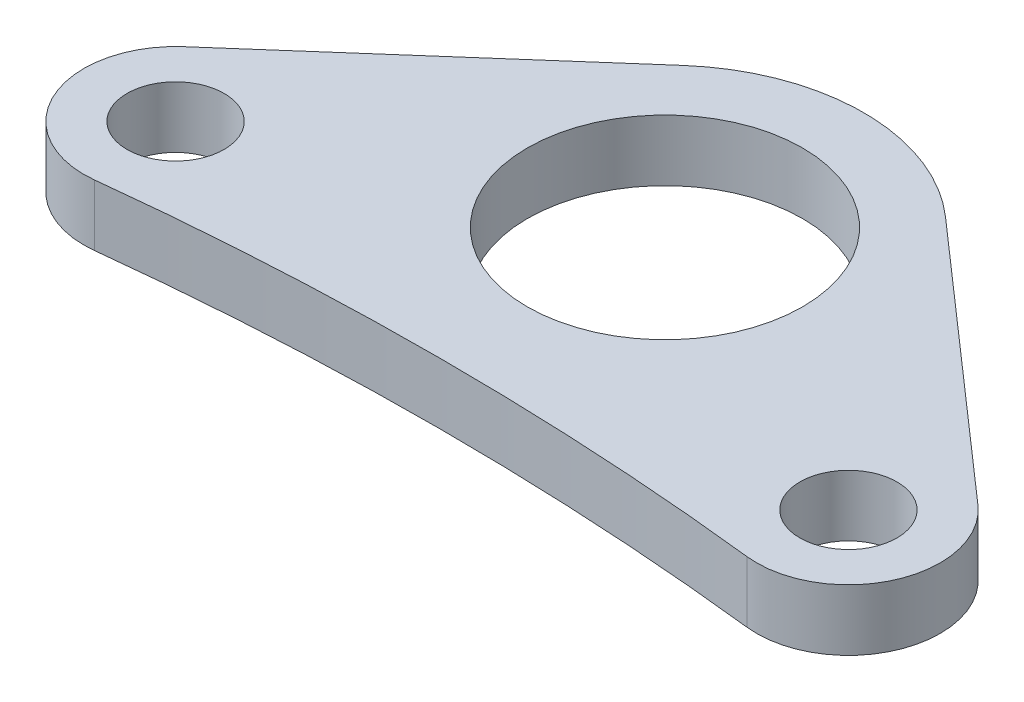
ISO-10303-21;
HEADER;
FILE_DESCRIPTION(('STEP AP214'),'2;1');
FILE_NAME('part.step','',(''),(''),'','','');
FILE_SCHEMA(('AUTOMOTIVE_DESIGN { 1 0 10303 214 1 1 1 1 }'));
ENDSEC;
DATA;
#1=APPLICATION_CONTEXT('core data for automotive mechanical design processes');
#2=APPLICATION_PROTOCOL_DEFINITION('international standard','automotive_design',2000,#1);
#3=PRODUCT_CONTEXT('',#1,'mechanical');
#4=PRODUCT('Part','Part','',(#3));
#5=PRODUCT_RELATED_PRODUCT_CATEGORY('part','',(#4));
#6=PRODUCT_DEFINITION_FORMATION('','',#4);
#7=PRODUCT_DEFINITION_CONTEXT('part definition',#1,'design');
#8=PRODUCT_DEFINITION('design','',#6,#7);
#9=PRODUCT_DEFINITION_SHAPE('','',#8);
#10=(LENGTH_UNIT() NAMED_UNIT(*) SI_UNIT(.MILLI.,.METRE.));
#11=(NAMED_UNIT(*) PLANE_ANGLE_UNIT() SI_UNIT($,.RADIAN.));
#12=(NAMED_UNIT(*) SI_UNIT($,.STERADIAN.) SOLID_ANGLE_UNIT());
#13=UNCERTAINTY_MEASURE_WITH_UNIT(LENGTH_MEASURE(1.E-05),#10,'distance_accuracy_value','');
#14=(GEOMETRIC_REPRESENTATION_CONTEXT(3) GLOBAL_UNCERTAINTY_ASSIGNED_CONTEXT((#13)) GLOBAL_UNIT_ASSIGNED_CONTEXT((#10,
#11,#12)) REPRESENTATION_CONTEXT('',''));
#15=CARTESIAN_POINT('',(0.,0.,0.));
#16=DIRECTION('',(0.,0.,1.));
#17=DIRECTION('',(1.,0.,0.));
#18=AXIS2_PLACEMENT_3D('',#15,#16,#17);
#19=CARTESIAN_POINT('',(0.,6.35,325.697740611466));
#20=DIRECTION('',(0.,-1.,0.));
#21=DIRECTION('',(0.,0.,-1.));
#22=AXIS2_PLACEMENT_3D('',#19,#20,#21);
#23=PLANE('',#22);
#24=CARTESIAN_POINT('',(-34.925,6.35,15.875));
#25=DIRECTION('',(0.,1.,0.));
#26=DIRECTION('',(0.,0.,1.));
#27=AXIS2_PLACEMENT_3D('',#24,#25,#26);
#28=CIRCLE('',#27,5.04189999999999);
#29=CARTESIAN_POINT('',(-34.925,6.35,20.9169));
#30=VERTEX_POINT('',#29);
#31=EDGE_CURVE('E187',#30,#30,#28,.T.);
#32=ORIENTED_EDGE('',*,*,#31,.F.);
#33=EDGE_LOOP('',(#32));
#34=FACE_BOUND('',#33,.T.);
#35=CARTESIAN_POINT('',(34.925,6.35,15.875));
#36=DIRECTION('',(0.,1.,0.));
#37=DIRECTION('',(0.,0.,1.));
#38=AXIS2_PLACEMENT_3D('',#35,#36,#37);
#39=CIRCLE('',#38,5.04189999999999);
#40=CARTESIAN_POINT('',(34.925,6.35,20.9169));
#41=VERTEX_POINT('',#40);
#42=EDGE_CURVE('E189',#41,#41,#39,.T.);
#43=ORIENTED_EDGE('',*,*,#42,.F.);
#44=EDGE_LOOP('',(#43));
#45=FACE_BOUND('',#44,.T.);
#46=CARTESIAN_POINT('',(0.,6.35,325.697740611466));
#47=DIRECTION('',(0.,-1.,0.));
#48=DIRECTION('',(0.,0.,-1.));
#49=AXIS2_PLACEMENT_3D('',#46,#47,#48);
#50=CIRCLE('',#49,302.26);
#51=CARTESIAN_POINT('',(-33.8580448065173,6.35,25.3400531755031));
#52=VERTEX_POINT('',#51);
#53=CARTESIAN_POINT('',(33.8580448065173,6.35,25.3400531755031));
#54=VERTEX_POINT('',#53);
#55=EDGE_CURVE('E137',#52,#54,#50,.T.);
#56=ORIENTED_EDGE('',*,*,#55,.T.);
#57=CARTESIAN_POINT('',(34.925,6.35,15.875));
#58=DIRECTION('',(0.,1.,0.));
#59=DIRECTION('',(0.,0.,1.));
#60=AXIS2_PLACEMENT_3D('',#57,#58,#59);
#61=CIRCLE('',#60,9.52500000000003);
#62=CARTESIAN_POINT('',(41.2092275392722,6.35,8.7171994136011));
#63=VERTEX_POINT('',#62);
#64=EDGE_CURVE('E95',#54,#63,#61,.T.);
#65=ORIENTED_EDGE('',*,*,#64,.T.);
#66=DIRECTION('',(-0.751475127180987,0.,-0.659761421445903));
#67=VECTOR('',#66,1.);
#68=CARTESIAN_POINT('',(13.6158263350898,6.35,-15.5085679371976));
#69=LINE('',#68,#67);
#70=CARTESIAN_POINT('',(13.6158263350898,6.35,-15.5085679371976));
#71=VERTEX_POINT('',#70);
#72=EDGE_CURVE('E108',#63,#71,#69,.T.);
#73=ORIENTED_EDGE('',*,*,#72,.T.);
#74=CARTESIAN_POINT('',(0.,6.35,0.));
#75=DIRECTION('',(0.,1.,0.));
#76=DIRECTION('',(0.,0.,-1.));
#77=AXIS2_PLACEMENT_3D('',#74,#75,#76);
#78=CIRCLE('',#77,20.6375);
#79=CARTESIAN_POINT('',(-13.6158263350898,6.35,-15.5085679371976));
#80=VERTEX_POINT('',#79);
#81=EDGE_CURVE('E102',#71,#80,#78,.T.);
#82=ORIENTED_EDGE('',*,*,#81,.T.);
#83=DIRECTION('',(-0.751475127180987,0.,0.659761421445904));
#84=VECTOR('',#83,1.);
#85=CARTESIAN_POINT('',(-41.2092275392722,6.35,8.7171994136011));
#86=LINE('',#85,#84);
#87=CARTESIAN_POINT('',(-41.2092275392723,6.35,8.71719941360108));
#88=VERTEX_POINT('',#87);
#89=EDGE_CURVE('E106',#80,#88,#86,.T.);
#90=ORIENTED_EDGE('',*,*,#89,.T.);
#91=CARTESIAN_POINT('',(-34.925,6.35,15.875));
#92=DIRECTION('',(0.,1.,0.));
#93=DIRECTION('',(0.,0.,-1.));
#94=AXIS2_PLACEMENT_3D('',#91,#92,#93);
#95=CIRCLE('',#94,9.52500000000003);
#96=EDGE_CURVE('E58',#88,#52,#95,.T.);
#97=ORIENTED_EDGE('',*,*,#96,.T.);
#98=EDGE_LOOP('',(#56,#65,#73,#82,#90,#97));
#99=FACE_BOUND('',#98,.T.);
#100=CARTESIAN_POINT('',(0.,6.35,0.));
#101=DIRECTION('',(0.,1.,0.));
#102=DIRECTION('',(0.,0.,1.));
#103=AXIS2_PLACEMENT_3D('',#100,#101,#102);
#104=CIRCLE('',#103,14.2875);
#105=CARTESIAN_POINT('',(0.,6.35,14.2875));
#106=VERTEX_POINT('',#105);
#107=EDGE_CURVE('E130',#106,#106,#104,.T.);
#108=ORIENTED_EDGE('',*,*,#107,.F.);
#109=EDGE_LOOP('',(#108));
#110=FACE_BOUND('',#109,.T.);
#111=ADVANCED_FACE('F41',(#34,#45,#99,#110),#23,.F.);
#112=CARTESIAN_POINT('',(0.,0.,325.697740611466));
#113=DIRECTION('',(0.,-1.,0.));
#114=DIRECTION('',(0.,0.,-1.));
#115=AXIS2_PLACEMENT_3D('',#112,#113,#114);
#116=PLANE('',#115);
#117=CARTESIAN_POINT('',(-34.925,0.,15.875));
#118=DIRECTION('',(0.,1.,0.));
#119=DIRECTION('',(0.,0.,1.));
#120=AXIS2_PLACEMENT_3D('',#117,#118,#119);
#121=CIRCLE('',#120,5.0419);
#122=CARTESIAN_POINT('',(-34.925,0.,20.9169));
#123=VERTEX_POINT('',#122);
#124=EDGE_CURVE('E185',#123,#123,#121,.T.);
#125=ORIENTED_EDGE('',*,*,#124,.T.);
#126=EDGE_LOOP('',(#125));
#127=FACE_BOUND('',#126,.T.);
#128=CARTESIAN_POINT('',(34.925,0.,15.875));
#129=DIRECTION('',(0.,1.,0.));
#130=DIRECTION('',(0.,0.,1.));
#131=AXIS2_PLACEMENT_3D('',#128,#129,#130);
#132=CIRCLE('',#131,5.0419);
#133=CARTESIAN_POINT('',(34.925,0.,20.9169));
#134=VERTEX_POINT('',#133);
#135=EDGE_CURVE('E194',#134,#134,#132,.T.);
#136=ORIENTED_EDGE('',*,*,#135,.T.);
#137=EDGE_LOOP('',(#136));
#138=FACE_BOUND('',#137,.T.);
#139=CARTESIAN_POINT('',(0.,0.,325.697740611466));
#140=DIRECTION('',(0.,-1.,0.));
#141=DIRECTION('',(0.,0.,-1.));
#142=AXIS2_PLACEMENT_3D('',#139,#140,#141);
#143=CIRCLE('',#142,302.26);
#144=CARTESIAN_POINT('',(-33.8580448065173,0.,25.3400531755031));
#145=VERTEX_POINT('',#144);
#146=CARTESIAN_POINT('',(33.8580448065173,0.,25.3400531755031));
#147=VERTEX_POINT('',#146);
#148=EDGE_CURVE('E126',#145,#147,#143,.T.);
#149=ORIENTED_EDGE('',*,*,#148,.F.);
#150=CARTESIAN_POINT('',(-34.925,0.,15.875));
#151=DIRECTION('',(0.,1.,0.));
#152=DIRECTION('',(0.,0.,-1.));
#153=AXIS2_PLACEMENT_3D('',#150,#151,#152);
#154=CIRCLE('',#153,9.52500000000003);
#155=CARTESIAN_POINT('',(-41.2092275392723,0.,8.71719941360108));
#156=VERTEX_POINT('',#155);
#157=EDGE_CURVE('E87',#156,#145,#154,.T.);
#158=ORIENTED_EDGE('',*,*,#157,.F.);
#159=DIRECTION('',(-0.751475127180987,0.,0.659761421445904));
#160=VECTOR('',#159,1.);
#161=CARTESIAN_POINT('',(-41.2092275392722,0.,8.7171994136011));
#162=LINE('',#161,#160);
#163=CARTESIAN_POINT('',(-13.6158263350898,0.,-15.5085679371976));
#164=VERTEX_POINT('',#163);
#165=EDGE_CURVE('E81',#164,#156,#162,.T.);
#166=ORIENTED_EDGE('',*,*,#165,.F.);
#167=CARTESIAN_POINT('',(0.,0.,0.));
#168=DIRECTION('',(0.,1.,0.));
#169=DIRECTION('',(0.,0.,-1.));
#170=AXIS2_PLACEMENT_3D('',#167,#168,#169);
#171=CIRCLE('',#170,20.6375);
#172=CARTESIAN_POINT('',(13.6158263350898,0.,-15.5085679371976));
#173=VERTEX_POINT('',#172);
#174=EDGE_CURVE('E116',#173,#164,#171,.T.);
#175=ORIENTED_EDGE('',*,*,#174,.F.);
#176=DIRECTION('',(-0.751475127180987,0.,-0.659761421445903));
#177=VECTOR('',#176,1.);
#178=CARTESIAN_POINT('',(13.6158263350898,0.,-15.5085679371976));
#179=LINE('',#178,#177);
#180=CARTESIAN_POINT('',(41.2092275392722,0.,8.7171994136011));
#181=VERTEX_POINT('',#180);
#182=EDGE_CURVE('E132',#181,#173,#179,.T.);
#183=ORIENTED_EDGE('',*,*,#182,.F.);
#184=CARTESIAN_POINT('',(34.925,0.,15.875));
#185=DIRECTION('',(0.,1.,0.));
#186=DIRECTION('',(0.,0.,1.));
#187=AXIS2_PLACEMENT_3D('',#184,#185,#186);
#188=CIRCLE('',#187,9.52500000000003);
#189=EDGE_CURVE('E129',#147,#181,#188,.T.);
#190=ORIENTED_EDGE('',*,*,#189,.F.);
#191=EDGE_LOOP('',(#149,#158,#166,#175,#183,#190));
#192=FACE_BOUND('',#191,.T.);
#193=CARTESIAN_POINT('',(0.,0.,0.));
#194=DIRECTION('',(0.,1.,0.));
#195=DIRECTION('',(0.,0.,1.));
#196=AXIS2_PLACEMENT_3D('',#193,#194,#195);
#197=CIRCLE('',#196,14.2875);
#198=CARTESIAN_POINT('',(0.,0.,14.2875));
#199=VERTEX_POINT('',#198);
#200=EDGE_CURVE('E197',#199,#199,#197,.T.);
#201=ORIENTED_EDGE('',*,*,#200,.T.);
#202=EDGE_LOOP('',(#201));
#203=FACE_BOUND('',#202,.T.);
#204=ADVANCED_FACE('F146',(#127,#138,#192,#203),#116,.T.);
#205=CARTESIAN_POINT('',(0.,6.35,325.697740611466));
#206=DIRECTION('',(0.,-1.,0.));
#207=DIRECTION('',(0.,0.,-1.));
#208=AXIS2_PLACEMENT_3D('',#205,#206,#207);
#209=CYLINDRICAL_SURFACE('',#208,302.26);
#210=ORIENTED_EDGE('',*,*,#148,.T.);
#211=DIRECTION('',(0.,-1.,0.));
#212=VECTOR('',#211,1.);
#213=CARTESIAN_POINT('',(33.8580448065173,6.35,25.3400531755031));
#214=LINE('',#213,#212);
#215=EDGE_CURVE('E11',#54,#147,#214,.T.);
#216=ORIENTED_EDGE('',*,*,#215,.F.);
#217=ORIENTED_EDGE('',*,*,#55,.F.);
#218=DIRECTION('',(0.,-1.,0.));
#219=VECTOR('',#218,1.);
#220=CARTESIAN_POINT('',(-33.8580448065173,6.35,25.3400531755031));
#221=LINE('',#220,#219);
#222=EDGE_CURVE('E122',#52,#145,#221,.T.);
#223=ORIENTED_EDGE('',*,*,#222,.T.);
#224=EDGE_LOOP('',(#210,#216,#217,#223));
#225=FACE_BOUND('',#224,.T.);
#226=ADVANCED_FACE('F43',(#225),#209,.F.);
#227=CARTESIAN_POINT('',(34.925,6.35,15.875));
#228=DIRECTION('',(0.,-1.,0.));
#229=DIRECTION('',(0.,0.,-1.));
#230=AXIS2_PLACEMENT_3D('',#227,#228,#229);
#231=CYLINDRICAL_SURFACE('',#230,9.52500000000003);
#232=ORIENTED_EDGE('',*,*,#189,.T.);
#233=DIRECTION('',(0.,-1.,0.));
#234=VECTOR('',#233,1.);
#235=CARTESIAN_POINT('',(41.2092275392722,6.35,8.7171994136011));
#236=LINE('',#235,#234);
#237=EDGE_CURVE('E50',#63,#181,#236,.T.);
#238=ORIENTED_EDGE('',*,*,#237,.F.);
#239=ORIENTED_EDGE('',*,*,#64,.F.);
#240=ORIENTED_EDGE('',*,*,#215,.T.);
#241=EDGE_LOOP('',(#232,#238,#239,#240));
#242=FACE_BOUND('',#241,.T.);
#243=ADVANCED_FACE('F234',(#242),#231,.T.);
#244=CARTESIAN_POINT('',(13.6158263350898,6.35,-15.5085679371976));
#245=DIRECTION('',(-0.659761421445903,0.,0.751475127180987));
#246=DIRECTION('',(0.751475127180987,0.,0.659761421445903));
#247=AXIS2_PLACEMENT_3D('',#244,#245,#246);
#248=PLANE('',#247);
#249=ORIENTED_EDGE('',*,*,#182,.T.);
#250=DIRECTION('',(0.,-1.,0.));
#251=VECTOR('',#250,1.);
#252=CARTESIAN_POINT('',(13.6158263350898,6.35,-15.5085679371976));
#253=LINE('',#252,#251);
#254=EDGE_CURVE('E117',#71,#173,#253,.T.);
#255=ORIENTED_EDGE('',*,*,#254,.F.);
#256=ORIENTED_EDGE('',*,*,#72,.F.);
#257=ORIENTED_EDGE('',*,*,#237,.T.);
#258=EDGE_LOOP('',(#249,#255,#256,#257));
#259=FACE_BOUND('',#258,.T.);
#260=ADVANCED_FACE('F143',(#259),#248,.F.);
#261=CARTESIAN_POINT('',(0.,6.35,0.));
#262=DIRECTION('',(0.,-1.,0.));
#263=DIRECTION('',(0.,0.,-1.));
#264=AXIS2_PLACEMENT_3D('',#261,#262,#263);
#265=CYLINDRICAL_SURFACE('',#264,20.6375);
#266=ORIENTED_EDGE('',*,*,#174,.T.);
#267=DIRECTION('',(0.,-1.,0.));
#268=VECTOR('',#267,1.);
#269=CARTESIAN_POINT('',(-13.6158263350898,6.35,-15.5085679371976));
#270=LINE('',#269,#268);
#271=EDGE_CURVE('E113',#80,#164,#270,.T.);
#272=ORIENTED_EDGE('',*,*,#271,.F.);
#273=ORIENTED_EDGE('',*,*,#81,.F.);
#274=ORIENTED_EDGE('',*,*,#254,.T.);
#275=EDGE_LOOP('',(#266,#272,#273,#274));
#276=FACE_BOUND('',#275,.T.);
#277=ADVANCED_FACE('F114',(#276),#265,.T.);
#278=CARTESIAN_POINT('',(-41.2092275392722,6.35,8.7171994136011));
#279=DIRECTION('',(0.659761421445904,0.,0.751475127180987));
#280=DIRECTION('',(0.751475127180987,0.,-0.659761421445904));
#281=AXIS2_PLACEMENT_3D('',#278,#279,#280);
#282=PLANE('',#281);
#283=ORIENTED_EDGE('',*,*,#165,.T.);
#284=DIRECTION('',(0.,-1.,0.));
#285=VECTOR('',#284,1.);
#286=CARTESIAN_POINT('',(-41.2092275392723,6.35,8.71719941360108));
#287=LINE('',#286,#285);
#288=EDGE_CURVE('E118',#88,#156,#287,.T.);
#289=ORIENTED_EDGE('',*,*,#288,.F.);
#290=ORIENTED_EDGE('',*,*,#89,.F.);
#291=ORIENTED_EDGE('',*,*,#271,.T.);
#292=EDGE_LOOP('',(#283,#289,#290,#291));
#293=FACE_BOUND('',#292,.T.);
#294=ADVANCED_FACE('F120',(#293),#282,.F.);
#295=CARTESIAN_POINT('',(-34.925,6.35,15.875));
#296=DIRECTION('',(0.,-1.,0.));
#297=DIRECTION('',(0.,0.,-1.));
#298=AXIS2_PLACEMENT_3D('',#295,#296,#297);
#299=CYLINDRICAL_SURFACE('',#298,9.52500000000003);
#300=ORIENTED_EDGE('',*,*,#157,.T.);
#301=ORIENTED_EDGE('',*,*,#222,.F.);
#302=ORIENTED_EDGE('',*,*,#96,.F.);
#303=ORIENTED_EDGE('',*,*,#288,.T.);
#304=EDGE_LOOP('',(#300,#301,#302,#303));
#305=FACE_BOUND('',#304,.T.);
#306=ADVANCED_FACE('F151',(#305),#299,.T.);
#307=CARTESIAN_POINT('',(0.,6.35,0.));
#308=DIRECTION('',(0.,-1.,0.));
#309=DIRECTION('',(0.,0.,-1.));
#310=AXIS2_PLACEMENT_3D('',#307,#308,#309);
#311=CYLINDRICAL_SURFACE('',#310,14.2875);
#312=ORIENTED_EDGE('',*,*,#107,.T.);
#313=EDGE_LOOP('',(#312));
#314=FACE_BOUND('',#313,.T.);
#315=ORIENTED_EDGE('',*,*,#200,.F.);
#316=EDGE_LOOP('',(#315));
#317=FACE_BOUND('',#316,.T.);
#318=ADVANCED_FACE('F153',(#314,#317),#311,.F.);
#319=CARTESIAN_POINT('',(34.925,6.35,15.875));
#320=DIRECTION('',(0.,1.,0.));
#321=DIRECTION('',(0.,0.,1.));
#322=AXIS2_PLACEMENT_3D('',#319,#320,#321);
#323=CYLINDRICAL_SURFACE('',#322,5.04189999999999);
#324=ORIENTED_EDGE('',*,*,#135,.F.);
#325=EDGE_LOOP('',(#324));
#326=FACE_BOUND('',#325,.T.);
#327=ORIENTED_EDGE('',*,*,#42,.T.);
#328=EDGE_LOOP('',(#327));
#329=FACE_BOUND('',#328,.T.);
#330=ADVANCED_FACE('F159',(#326,#329),#323,.F.);
#331=CARTESIAN_POINT('',(-34.925,6.35,15.875));
#332=DIRECTION('',(0.,1.,0.));
#333=DIRECTION('',(0.,0.,1.));
#334=AXIS2_PLACEMENT_3D('',#331,#332,#333);
#335=CYLINDRICAL_SURFACE('',#334,5.04189999999999);
#336=ORIENTED_EDGE('',*,*,#124,.F.);
#337=EDGE_LOOP('',(#336));
#338=FACE_BOUND('',#337,.T.);
#339=ORIENTED_EDGE('',*,*,#31,.T.);
#340=EDGE_LOOP('',(#339));
#341=FACE_BOUND('',#340,.T.);
#342=ADVANCED_FACE('F176',(#338,#341),#335,.F.);
#343=CLOSED_SHELL('',(#111,#204,#226,#243,#260,#277,#294,#306,#318,#330,#342));
#344=MANIFOLD_SOLID_BREP('B2',#343);
#345=ADVANCED_BREP_SHAPE_REPRESENTATION('',(#18,#344),#14);
#346=SHAPE_DEFINITION_REPRESENTATION(#9,#345);
ENDSEC;
END-ISO-10303-21;
